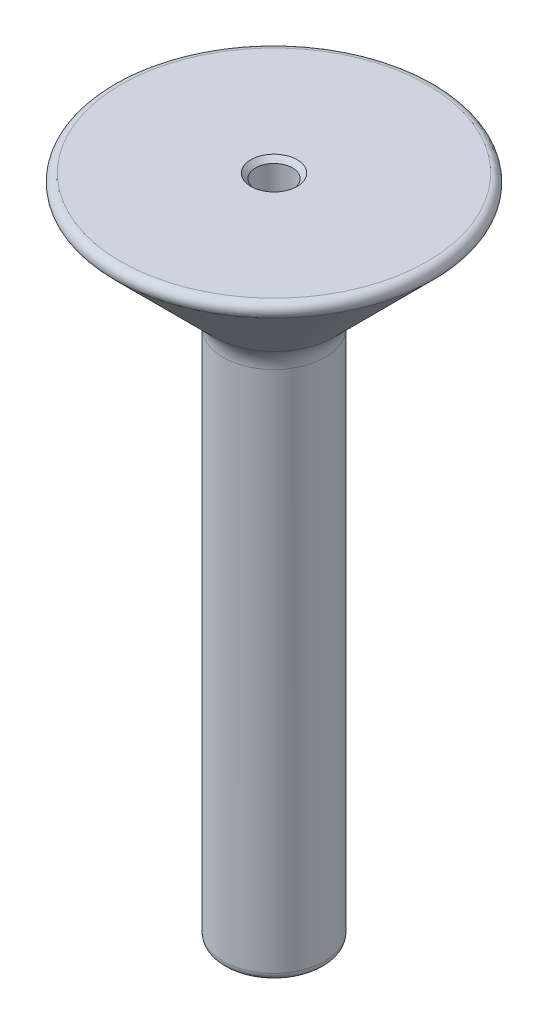
ISO-10303-21;
HEADER;
FILE_DESCRIPTION(('STEP AP214'),'2;1');
FILE_NAME('part.step','',(''),(''),'','','');
FILE_SCHEMA(('AUTOMOTIVE_DESIGN { 1 0 10303 214 1 1 1 1 }'));
ENDSEC;
DATA;
#1=APPLICATION_CONTEXT('core data for automotive mechanical design processes');
#2=APPLICATION_PROTOCOL_DEFINITION('international standard','automotive_design',2000,#1);
#3=PRODUCT_CONTEXT('',#1,'mechanical');
#4=PRODUCT('Part','Part','',(#3));
#5=PRODUCT_RELATED_PRODUCT_CATEGORY('part','',(#4));
#6=PRODUCT_DEFINITION_FORMATION('','',#4);
#7=PRODUCT_DEFINITION_CONTEXT('part definition',#1,'design');
#8=PRODUCT_DEFINITION('design','',#6,#7);
#9=PRODUCT_DEFINITION_SHAPE('','',#8);
#10=(LENGTH_UNIT() NAMED_UNIT(*) SI_UNIT(.MILLI.,.METRE.));
#11=(NAMED_UNIT(*) PLANE_ANGLE_UNIT() SI_UNIT($,.RADIAN.));
#12=(NAMED_UNIT(*) SI_UNIT($,.STERADIAN.) SOLID_ANGLE_UNIT());
#13=UNCERTAINTY_MEASURE_WITH_UNIT(LENGTH_MEASURE(1.E-05),#10,'distance_accuracy_value','');
#14=(GEOMETRIC_REPRESENTATION_CONTEXT(3) GLOBAL_UNCERTAINTY_ASSIGNED_CONTEXT((#13)) GLOBAL_UNIT_ASSIGNED_CONTEXT((#10,
#11,#12)) REPRESENTATION_CONTEXT('',''));
#15=CARTESIAN_POINT('',(0.,0.,0.));
#16=DIRECTION('',(0.,0.,1.));
#17=DIRECTION('',(1.,0.,0.));
#18=AXIS2_PLACEMENT_3D('',#15,#16,#17);
#19=CARTESIAN_POINT('',(0.,12.7,0.));
#20=DIRECTION('',(0.,-1.,0.));
#21=DIRECTION('',(0.,0.,-1.));
#22=AXIS2_PLACEMENT_3D('',#19,#20,#21);
#23=CYLINDRICAL_SURFACE('',#22,8.255);
#24=CARTESIAN_POINT('',(0.,86.1607951031449,0.));
#25=DIRECTION('',(0.,-1.,0.));
#26=DIRECTION('',(0.,0.,-1.));
#27=AXIS2_PLACEMENT_3D('',#24,#25,#26);
#28=CIRCLE('',#27,8.255);
#29=CARTESIAN_POINT('',(0.,86.1607951031449,-8.255));
#30=VERTEX_POINT('',#29);
#31=EDGE_CURVE('E40',#30,#30,#28,.T.);
#32=ORIENTED_EDGE('',*,*,#31,.T.);
#33=EDGE_LOOP('',(#32));
#34=FACE_BOUND('',#33,.T.);
#35=CARTESIAN_POINT('',(0.,1.27,0.));
#36=DIRECTION('',(0.,1.,0.));
#37=DIRECTION('',(0.,0.,1.));
#38=AXIS2_PLACEMENT_3D('',#35,#36,#37);
#39=CIRCLE('',#38,8.255);
#40=CARTESIAN_POINT('',(0.,1.27,8.255));
#41=VERTEX_POINT('',#40);
#42=EDGE_CURVE('E53',#41,#41,#39,.T.);
#43=ORIENTED_EDGE('',*,*,#42,.T.);
#44=EDGE_LOOP('',(#43));
#45=FACE_BOUND('',#44,.T.);
#46=ADVANCED_FACE('F33',(#34,#45),#23,.T.);
#47=CARTESIAN_POINT('',(-8.25499999999999,0.,0.));
#48=DIRECTION('',(0.,1.,0.));
#49=DIRECTION('',(0.,0.,1.));
#50=AXIS2_PLACEMENT_3D('',#47,#48,#49);
#51=PLANE('',#50);
#52=CARTESIAN_POINT('',(0.,0.,0.));
#53=DIRECTION('',(0.,1.,0.));
#54=DIRECTION('',(0.,0.,1.));
#55=AXIS2_PLACEMENT_3D('',#52,#53,#54);
#56=CIRCLE('',#55,6.98499999999999);
#57=CARTESIAN_POINT('',(0.,0.,6.98499999999999));
#58=VERTEX_POINT('',#57);
#59=EDGE_CURVE('E56',#58,#58,#56,.F.);
#60=ORIENTED_EDGE('',*,*,#59,.T.);
#61=EDGE_LOOP('',(#60));
#62=FACE_BOUND('',#61,.T.);
#63=CARTESIAN_POINT('',(0.,0.,0.));
#64=DIRECTION('',(0.,1.,0.));
#65=DIRECTION('',(0.,0.,1.));
#66=AXIS2_PLACEMENT_3D('',#63,#64,#65);
#67=CIRCLE('',#66,5.842);
#68=CARTESIAN_POINT('',(0.,0.,-5.842));
#69=VERTEX_POINT('',#68);
#70=EDGE_CURVE('E65',#69,#69,#67,.T.);
#71=ORIENTED_EDGE('',*,*,#70,.T.);
#72=EDGE_LOOP('',(#71));
#73=FACE_BOUND('',#72,.T.);
#74=ADVANCED_FACE('F95',(#62,#73),#51,.F.);
#75=CARTESIAN_POINT('',(0.,12.7,0.));
#76=DIRECTION('',(0.,-1.,0.));
#77=DIRECTION('',(0.,0.,-1.));
#78=AXIS2_PLACEMENT_3D('',#75,#76,#77);
#79=CYLINDRICAL_SURFACE('',#78,5.08);
#80=CARTESIAN_POINT('',(0.,0.761999999999988,0.));
#81=DIRECTION('',(0.,1.,0.));
#82=DIRECTION('',(0.,0.,1.));
#83=AXIS2_PLACEMENT_3D('',#80,#81,#82);
#84=CIRCLE('',#83,5.08);
#85=CARTESIAN_POINT('',(0.,0.761999999999988,-5.08));
#86=VERTEX_POINT('',#85);
#87=EDGE_CURVE('E68',#86,#86,#84,.F.);
#88=ORIENTED_EDGE('',*,*,#87,.T.);
#89=EDGE_LOOP('',(#88));
#90=FACE_BOUND('',#89,.T.);
#91=CARTESIAN_POINT('',(0.,12.7,0.));
#92=DIRECTION('',(0.,-1.,0.));
#93=DIRECTION('',(0.,0.,-1.));
#94=AXIS2_PLACEMENT_3D('',#91,#92,#93);
#95=CIRCLE('',#94,5.08);
#96=CARTESIAN_POINT('',(0.,12.7,-5.08));
#97=VERTEX_POINT('',#96);
#98=EDGE_CURVE('E71',#97,#97,#95,.T.);
#99=ORIENTED_EDGE('',*,*,#98,.F.);
#100=EDGE_LOOP('',(#99));
#101=FACE_BOUND('',#100,.T.);
#102=ADVANCED_FACE('F91',(#90,#101),#79,.F.);
#103=CARTESIAN_POINT('',(-5.08,12.7,0.));
#104=DIRECTION('',(0.,1.,0.));
#105=DIRECTION('',(0.,0.,1.));
#106=AXIS2_PLACEMENT_3D('',#103,#104,#105);
#107=PLANE('',#106);
#108=ORIENTED_EDGE('',*,*,#98,.T.);
#109=EDGE_LOOP('',(#108));
#110=FACE_BOUND('',#109,.T.);
#111=ADVANCED_FACE('F82',(#110),#107,.F.);
#112=CARTESIAN_POINT('',(0.,98.95,0.));
#113=DIRECTION('',(0.,-1.,0.));
#114=DIRECTION('',(0.,0.,-1.));
#115=AXIS2_PLACEMENT_3D('',#112,#113,#114);
#116=PLANE('',#115);
#117=CARTESIAN_POINT('',(0.,98.95,0.));
#118=DIRECTION('',(0.,-1.,0.));
#119=DIRECTION('',(0.,0.,-1.));
#120=AXIS2_PLACEMENT_3D('',#117,#118,#119);
#121=CIRCLE('',#120,3.);
#122=CARTESIAN_POINT('',(0.,98.95,-3.));
#123=VERTEX_POINT('',#122);
#124=EDGE_CURVE('E74',#123,#123,#121,.T.);
#125=ORIENTED_EDGE('',*,*,#124,.F.);
#126=EDGE_LOOP('',(#125));
#127=FACE_BOUND('',#126,.T.);
#128=ADVANCED_FACE('F80',(#127),#116,.F.);
#129=CARTESIAN_POINT('',(0.,12.7,0.));
#130=DIRECTION('',(0.,-1.,0.));
#131=DIRECTION('',(0.,0.,-1.));
#132=AXIS2_PLACEMENT_3D('',#129,#130,#131);
#133=CYLINDRICAL_SURFACE('',#132,3.);
#134=CARTESIAN_POINT('',(0.,107.188,0.));
#135=DIRECTION('',(0.,-1.,0.));
#136=DIRECTION('',(0.,0.,-1.));
#137=AXIS2_PLACEMENT_3D('',#134,#135,#136);
#138=CIRCLE('',#137,3.);
#139=CARTESIAN_POINT('',(0.,107.188,-3.));
#140=VERTEX_POINT('',#139);
#141=EDGE_CURVE('E59',#140,#140,#138,.F.);
#142=ORIENTED_EDGE('',*,*,#141,.T.);
#143=EDGE_LOOP('',(#142));
#144=FACE_BOUND('',#143,.T.);
#145=ORIENTED_EDGE('',*,*,#124,.T.);
#146=EDGE_LOOP('',(#145));
#147=FACE_BOUND('',#146,.T.);
#148=ADVANCED_FACE('F78',(#144,#147),#133,.F.);
#149=CARTESIAN_POINT('',(-3.,107.95,0.));
#150=DIRECTION('',(0.,-1.,0.));
#151=DIRECTION('',(0.,0.,-1.));
#152=AXIS2_PLACEMENT_3D('',#149,#150,#151);
#153=PLANE('',#152);
#154=CARTESIAN_POINT('',(0.,107.95,0.));
#155=DIRECTION('',(0.,-1.,0.));
#156=DIRECTION('',(0.,0.,-1.));
#157=AXIS2_PLACEMENT_3D('',#154,#155,#156);
#158=CIRCLE('',#157,24.8739487757862);
#159=CARTESIAN_POINT('',(0.,107.95,-24.8739487757862));
#160=VERTEX_POINT('',#159);
#161=EDGE_CURVE('E44',#160,#160,#158,.F.);
#162=ORIENTED_EDGE('',*,*,#161,.T.);
#163=EDGE_LOOP('',(#162));
#164=FACE_BOUND('',#163,.T.);
#165=CARTESIAN_POINT('',(0.,107.95,0.));
#166=DIRECTION('',(0.,-1.,0.));
#167=DIRECTION('',(0.,0.,-1.));
#168=AXIS2_PLACEMENT_3D('',#165,#166,#167);
#169=CIRCLE('',#168,3.76199999999997);
#170=CARTESIAN_POINT('',(0.,107.95,-3.76199999999997));
#171=VERTEX_POINT('',#170);
#172=EDGE_CURVE('E62',#171,#171,#169,.T.);
#173=ORIENTED_EDGE('',*,*,#172,.T.);
#174=EDGE_LOOP('',(#173));
#175=FACE_BOUND('',#174,.T.);
#176=ADVANCED_FACE('F88',(#164,#175),#153,.F.);
#177=CARTESIAN_POINT('',(0.,107.95,0.));
#178=DIRECTION('',(0.,1.,0.));
#179=DIRECTION('',(0.,0.,1.));
#180=AXIS2_PLACEMENT_3D('',#177,#178,#179);
#181=CONICAL_SURFACE('',#180,27.94,0.785398163397454);
#182=CARTESIAN_POINT('',(0.,89.7528975515726,0.));
#183=DIRECTION('',(0.,1.,0.));
#184=DIRECTION('',(0.,0.,1.));
#185=AXIS2_PLACEMENT_3D('',#182,#183,#184);
#186=CIRCLE('',#185,9.74289755157236);
#187=CARTESIAN_POINT('',(0.,89.7528975515726,9.74289755157236));
#188=VERTEX_POINT('',#187);
#189=EDGE_CURVE('E10',#188,#188,#186,.T.);
#190=ORIENTED_EDGE('',*,*,#189,.T.);
#191=EDGE_LOOP('',(#190));
#192=FACE_BOUND('',#191,.T.);
#193=CARTESIAN_POINT('',(0.,105.781974387893,0.));
#194=DIRECTION('',(0.,-1.,0.));
#195=DIRECTION('',(0.,0.,-1.));
#196=AXIS2_PLACEMENT_3D('',#193,#194,#195);
#197=CIRCLE('',#196,25.7719743878931);
#198=CARTESIAN_POINT('',(0.,105.781974387893,-25.7719743878931));
#199=VERTEX_POINT('',#198);
#200=EDGE_CURVE('E48',#199,#199,#197,.T.);
#201=ORIENTED_EDGE('',*,*,#200,.T.);
#202=EDGE_LOOP('',(#201));
#203=FACE_BOUND('',#202,.T.);
#204=ADVANCED_FACE('F113',(#192,#203),#181,.T.);
#205=CARTESIAN_POINT('',(0.,0.761999999999988,0.));
#206=DIRECTION('',(0.,-1.,0.));
#207=DIRECTION('',(0.,0.,-1.));
#208=AXIS2_PLACEMENT_3D('',#205,#206,#207);
#209=CONICAL_SURFACE('',#208,5.08,0.785398163397456);
#210=CARTESIAN_POINT('',(0.,0.,-5.842));
#211=CARTESIAN_POINT('',(0.,0.0079375,-5.8340625));
#212=CARTESIAN_POINT('',(0.,0.0158749999999998,-5.826125));
#213=CARTESIAN_POINT('',(0.,0.0317499999999994,-5.81025));
#214=CARTESIAN_POINT('',(0.,0.0396874999999992,-5.8023125));
#215=CARTESIAN_POINT('',(0.,0.055562499999999,-5.7864375));
#216=CARTESIAN_POINT('',(0.,0.063499999999999,-5.7785));
#217=CARTESIAN_POINT('',(0.,0.0793749999999987,-5.762625));
#218=CARTESIAN_POINT('',(0.,0.0873124999999985,-5.7546875));
#219=CARTESIAN_POINT('',(0.,0.103187499999998,-5.7388125));
#220=CARTESIAN_POINT('',(0.,0.111124999999998,-5.730875));
#221=CARTESIAN_POINT('',(0.,0.126999999999998,-5.715));
#222=CARTESIAN_POINT('',(0.,0.134937499999998,-5.7070625));
#223=CARTESIAN_POINT('',(0.,0.150812499999998,-5.6911875));
#224=CARTESIAN_POINT('',(0.,0.158749999999998,-5.68325));
#225=CARTESIAN_POINT('',(0.,0.174624999999997,-5.667375));
#226=CARTESIAN_POINT('',(0.,0.182562499999997,-5.6594375));
#227=CARTESIAN_POINT('',(0.,0.198437499999997,-5.6435625));
#228=CARTESIAN_POINT('',(0.,0.206374999999997,-5.635625));
#229=CARTESIAN_POINT('',(0.,0.222249999999997,-5.61975));
#230=CARTESIAN_POINT('',(0.,0.230187499999996,-5.6118125));
#231=CARTESIAN_POINT('',(0.,0.246062499999996,-5.5959375));
#232=CARTESIAN_POINT('',(0.,0.253999999999996,-5.588));
#233=CARTESIAN_POINT('',(0.,0.269874999999996,-5.572125));
#234=CARTESIAN_POINT('',(0.,0.277812499999996,-5.5641875));
#235=CARTESIAN_POINT('',(0.,0.293687499999995,-5.5483125));
#236=CARTESIAN_POINT('',(0.,0.301624999999995,-5.540375));
#237=CARTESIAN_POINT('',(0.,0.317499999999995,-5.5245));
#238=CARTESIAN_POINT('',(0.,0.325437499999995,-5.5165625));
#239=CARTESIAN_POINT('',(0.,0.341312499999995,-5.5006875));
#240=CARTESIAN_POINT('',(0.,0.349249999999994,-5.49275));
#241=CARTESIAN_POINT('',(0.,0.365124999999994,-5.476875));
#242=CARTESIAN_POINT('',(0.,0.373062499999994,-5.4689375));
#243=CARTESIAN_POINT('',(0.,0.388937499999994,-5.4530625));
#244=CARTESIAN_POINT('',(0.,0.396874999999994,-5.445125));
#245=CARTESIAN_POINT('',(0.,0.412749999999994,-5.42925));
#246=CARTESIAN_POINT('',(0.,0.420687499999994,-5.4213125));
#247=CARTESIAN_POINT('',(0.,0.436562499999993,-5.4054375));
#248=CARTESIAN_POINT('',(0.,0.444499999999993,-5.3975));
#249=CARTESIAN_POINT('',(0.,0.460374999999993,-5.381625));
#250=CARTESIAN_POINT('',(0.,0.468312499999993,-5.3736875));
#251=CARTESIAN_POINT('',(0.,0.484187499999993,-5.3578125));
#252=CARTESIAN_POINT('',(0.,0.492124999999992,-5.349875));
#253=CARTESIAN_POINT('',(0.,0.507999999999992,-5.334));
#254=CARTESIAN_POINT('',(0.,0.515937499999992,-5.3260625));
#255=CARTESIAN_POINT('',(0.,0.531812499999992,-5.3101875));
#256=CARTESIAN_POINT('',(0.,0.539749999999992,-5.30225));
#257=CARTESIAN_POINT('',(0.,0.555624999999991,-5.286375));
#258=CARTESIAN_POINT('',(0.,0.563562499999991,-5.2784375));
#259=CARTESIAN_POINT('',(0.,0.579437499999991,-5.2625625));
#260=CARTESIAN_POINT('',(0.,0.587374999999991,-5.254625));
#261=CARTESIAN_POINT('',(0.,0.603249999999991,-5.23875));
#262=CARTESIAN_POINT('',(0.,0.611187499999991,-5.2308125));
#263=CARTESIAN_POINT('',(0.,0.62706249999999,-5.2149375));
#264=CARTESIAN_POINT('',(0.,0.63499999999999,-5.207));
#265=CARTESIAN_POINT('',(0.,0.65087499999999,-5.191125));
#266=CARTESIAN_POINT('',(0.,0.65881249999999,-5.1831875));
#267=CARTESIAN_POINT('',(0.,0.67468749999999,-5.1673125));
#268=CARTESIAN_POINT('',(0.,0.68262499999999,-5.159375));
#269=CARTESIAN_POINT('',(0.,0.698499999999989,-5.1435));
#270=CARTESIAN_POINT('',(0.,0.706437499999989,-5.1355625));
#271=CARTESIAN_POINT('',(0.,0.722312499999989,-5.1196875));
#272=CARTESIAN_POINT('',(0.,0.730249999999989,-5.11175));
#273=CARTESIAN_POINT('',(0.,0.746124999999989,-5.095875));
#274=CARTESIAN_POINT('',(0.,0.754062499999989,-5.0879375));
#275=CARTESIAN_POINT('',(0.,0.761999999999988,-5.08));
#276=B_SPLINE_CURVE_WITH_KNOTS('',3,(#210,#211,#212,#213,#214,#215,#216,#217,#218,#219,#220,
#221,#222,#223,#224,#225,#226,#227,#228,#229,#230,#231,#232,#233,#234,#235,#236,#237,#238,#239,
#240,#241,#242,#243,#244,#245,#246,#247,#248,#249,#250,#251,#252,#253,#254,#255,#256,#257,#258,
#259,#260,#261,#262,#263,#264,#265,#266,#267,#268,#269,#270,#271,#272,#273,#274,#275),
.UNSPECIFIED.,.F.,.F.,(4,2,2,2,2,2,2,2,2,2,2,2,2,2,2,2,2,2,2,2,2,2,2,2,2,2,2,2,2,2,2,2,4),(0.,
0.0336759604540087,0.0673519209080181,0.101027881362027,0.134703841816036,0.168379802270045,
0.202055762724054,0.235731723178063,0.269407683632072,0.303083644086081,0.33675960454009,
0.3704355649941,0.404111525448108,0.437787485902118,0.471463446356127,0.505139406810136,
0.538815367264145,0.572491327718154,0.606167288172163,0.639843248626172,0.673519209080181,
0.70719516953419,0.740871129988199,0.774547090442208,0.808223050896217,0.841899011350226,
0.875574971804235,0.909250932258244,0.942926892712253,0.976602853166262,1.01027881362027,
1.04395477407428,1.07763073452829),.UNSPECIFIED.);
#277=EDGE_CURVE('BSEAM106',#69,#86,#276,.T.);
#278=ORIENTED_EDGE('',*,*,#70,.F.);
#279=ORIENTED_EDGE('',*,*,#87,.F.);
#280=ORIENTED_EDGE('',*,*,#277,.T.);
#281=ORIENTED_EDGE('',*,*,#277,.F.);
#282=EDGE_LOOP('',(#278,#280,#279,#281));
#283=FACE_BOUND('',#282,.T.);
#284=ADVANCED_FACE('F106',(#283),#209,.F.);
#285=CARTESIAN_POINT('',(0.,107.95,0.));
#286=DIRECTION('',(0.,1.,0.));
#287=DIRECTION('',(0.,0.,1.));
#288=AXIS2_PLACEMENT_3D('',#285,#286,#287);
#289=CONICAL_SURFACE('',#288,3.76199999999997,0.785398163397448);
#290=ORIENTED_EDGE('',*,*,#141,.F.);
#291=EDGE_LOOP('',(#290));
#292=FACE_BOUND('',#291,.T.);
#293=ORIENTED_EDGE('',*,*,#172,.F.);
#294=EDGE_LOOP('',(#293));
#295=FACE_BOUND('',#294,.T.);
#296=ADVANCED_FACE('F112',(#292,#295),#289,.F.);
#297=CARTESIAN_POINT('',(0.,1.27,0.));
#298=DIRECTION('',(0.,1.,0.));
#299=DIRECTION('',(0.,0.,1.));
#300=AXIS2_PLACEMENT_3D('',#297,#298,#299);
#301=TOROIDAL_SURFACE('',#300,6.98499999999999,1.27);
#302=ORIENTED_EDGE('',*,*,#42,.F.);
#303=EDGE_LOOP('',(#302));
#304=FACE_BOUND('',#303,.T.);
#305=ORIENTED_EDGE('',*,*,#59,.F.);
#306=EDGE_LOOP('',(#305));
#307=FACE_BOUND('',#306,.T.);
#308=ADVANCED_FACE('F119',(#304,#307),#301,.T.);
#309=CARTESIAN_POINT('',(0.,106.68,0.));
#310=DIRECTION('',(0.,-1.,0.));
#311=DIRECTION('',(0.,0.,-1.));
#312=AXIS2_PLACEMENT_3D('',#309,#310,#311);
#313=TOROIDAL_SURFACE('',#312,24.8739487757862,1.27);
#314=ORIENTED_EDGE('',*,*,#161,.F.);
#315=EDGE_LOOP('',(#314));
#316=FACE_BOUND('',#315,.T.);
#317=ORIENTED_EDGE('',*,*,#200,.F.);
#318=EDGE_LOOP('',(#317));
#319=FACE_BOUND('',#318,.T.);
#320=ADVANCED_FACE('F122',(#316,#319),#313,.T.);
#321=CARTESIAN_POINT('',(0.,86.1607951031449,0.));
#322=DIRECTION('',(0.,-1.,0.));
#323=DIRECTION('',(0.,0.,-1.));
#324=AXIS2_PLACEMENT_3D('',#321,#322,#323);
#325=TOROIDAL_SURFACE('',#324,13.335,5.08);
#326=ORIENTED_EDGE('',*,*,#189,.F.);
#327=EDGE_LOOP('',(#326));
#328=FACE_BOUND('',#327,.T.);
#329=ORIENTED_EDGE('',*,*,#31,.F.);
#330=EDGE_LOOP('',(#329));
#331=FACE_BOUND('',#330,.T.);
#332=ADVANCED_FACE('F35',(#328,#331),#325,.F.);
#333=CLOSED_SHELL('',(#46,#74,#102,#111,#128,#148,#176,#204,#284,#296,#308,#320,#332));
#334=MANIFOLD_SOLID_BREP('B2',#333);
#335=ADVANCED_BREP_SHAPE_REPRESENTATION('',(#18,#334),#14);
#336=SHAPE_DEFINITION_REPRESENTATION(#9,#335);
ENDSEC;
END-ISO-10303-21;
